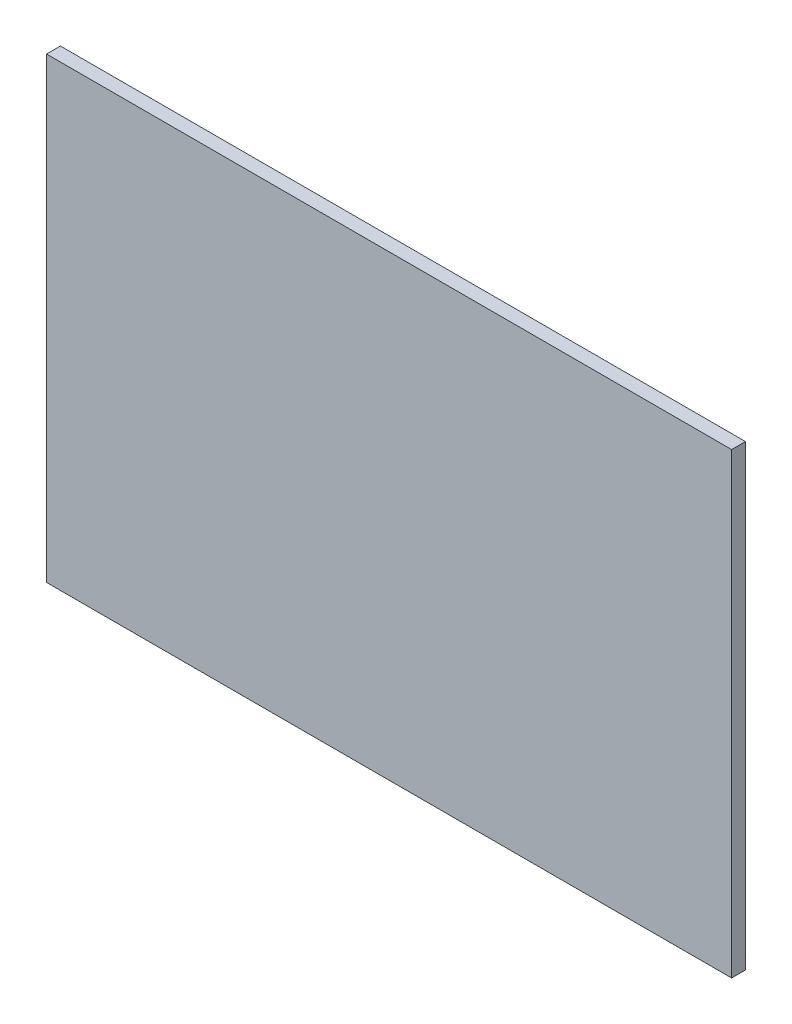
ISO-10303-21;
HEADER;
FILE_DESCRIPTION(('STEP AP214'),'2;1');
FILE_NAME('part.step','',(''),(''),'','','');
FILE_SCHEMA(('AUTOMOTIVE_DESIGN { 1 0 10303 214 1 1 1 1 }'));
ENDSEC;
DATA;
#1=APPLICATION_CONTEXT('core data for automotive mechanical design processes');
#2=APPLICATION_PROTOCOL_DEFINITION('international standard','automotive_design',2000,#1);
#3=PRODUCT_CONTEXT('',#1,'mechanical');
#4=PRODUCT('Part','Part','',(#3));
#5=PRODUCT_RELATED_PRODUCT_CATEGORY('part','',(#4));
#6=PRODUCT_DEFINITION_FORMATION('','',#4);
#7=PRODUCT_DEFINITION_CONTEXT('part definition',#1,'design');
#8=PRODUCT_DEFINITION('design','',#6,#7);
#9=PRODUCT_DEFINITION_SHAPE('','',#8);
#10=(LENGTH_UNIT() NAMED_UNIT(*) SI_UNIT(.MILLI.,.METRE.));
#11=(NAMED_UNIT(*) PLANE_ANGLE_UNIT() SI_UNIT($,.RADIAN.));
#12=(NAMED_UNIT(*) SI_UNIT($,.STERADIAN.) SOLID_ANGLE_UNIT());
#13=UNCERTAINTY_MEASURE_WITH_UNIT(LENGTH_MEASURE(1.E-05),#10,'distance_accuracy_value','');
#14=(GEOMETRIC_REPRESENTATION_CONTEXT(3) GLOBAL_UNCERTAINTY_ASSIGNED_CONTEXT((#13)) GLOBAL_UNIT_ASSIGNED_CONTEXT((#10,
#11,#12)) REPRESENTATION_CONTEXT('',''));
#15=CARTESIAN_POINT('',(0.,0.,0.));
#16=DIRECTION('',(0.,0.,1.));
#17=DIRECTION('',(1.,0.,0.));
#18=AXIS2_PLACEMENT_3D('',#15,#16,#17);
#19=CARTESIAN_POINT('',(0.,0.05,0.5));
#20=DIRECTION('',(0.,0.,1.));
#21=DIRECTION('',(1.,0.,0.));
#22=AXIS2_PLACEMENT_3D('',#19,#20,#21);
#23=PLANE('',#22);
#24=DIRECTION('',(0.,1.,0.));
#25=VECTOR('',#24,1.);
#26=CARTESIAN_POINT('',(-12.35,-8.2,0.5));
#27=LINE('',#26,#25);
#28=CARTESIAN_POINT('',(-12.35,-8.2,0.5));
#29=VERTEX_POINT('',#28);
#30=CARTESIAN_POINT('',(-12.35,8.3,0.5));
#31=VERTEX_POINT('',#30);
#32=EDGE_CURVE('E27',#29,#31,#27,.T.);
#33=ORIENTED_EDGE('',*,*,#32,.F.);
#34=DIRECTION('',(-1.,0.,0.));
#35=VECTOR('',#34,1.);
#36=CARTESIAN_POINT('',(12.35,-8.2,0.5));
#37=LINE('',#36,#35);
#38=CARTESIAN_POINT('',(12.35,-8.2,0.5));
#39=VERTEX_POINT('',#38);
#40=EDGE_CURVE('E60',#39,#29,#37,.T.);
#41=ORIENTED_EDGE('',*,*,#40,.F.);
#42=DIRECTION('',(0.,-1.,0.));
#43=VECTOR('',#42,1.);
#44=CARTESIAN_POINT('',(12.35,8.3,0.5));
#45=LINE('',#44,#43);
#46=CARTESIAN_POINT('',(12.35,8.3,0.5));
#47=VERTEX_POINT('',#46);
#48=EDGE_CURVE('E86',#47,#39,#45,.T.);
#49=ORIENTED_EDGE('',*,*,#48,.F.);
#50=DIRECTION('',(1.,0.,0.));
#51=VECTOR('',#50,1.);
#52=CARTESIAN_POINT('',(-12.35,8.3,0.5));
#53=LINE('',#52,#51);
#54=EDGE_CURVE('E91',#31,#47,#53,.T.);
#55=ORIENTED_EDGE('',*,*,#54,.F.);
#56=EDGE_LOOP('',(#33,#41,#49,#55));
#57=FACE_BOUND('',#56,.T.);
#58=ADVANCED_FACE('F17',(#57),#23,.T.);
#59=CARTESIAN_POINT('',(0.,0.05,0.));
#60=DIRECTION('',(0.,0.,1.));
#61=DIRECTION('',(1.,0.,0.));
#62=AXIS2_PLACEMENT_3D('',#59,#60,#61);
#63=PLANE('',#62);
#64=DIRECTION('',(1.,0.,0.));
#65=VECTOR('',#64,1.);
#66=CARTESIAN_POINT('',(-12.35,8.3,0.));
#67=LINE('',#66,#65);
#68=CARTESIAN_POINT('',(-12.35,8.3,0.));
#69=VERTEX_POINT('',#68);
#70=CARTESIAN_POINT('',(12.35,8.3,0.));
#71=VERTEX_POINT('',#70);
#72=EDGE_CURVE('E76',#69,#71,#67,.T.);
#73=ORIENTED_EDGE('',*,*,#72,.T.);
#74=DIRECTION('',(0.,-1.,0.));
#75=VECTOR('',#74,1.);
#76=CARTESIAN_POINT('',(12.35,8.3,0.));
#77=LINE('',#76,#75);
#78=CARTESIAN_POINT('',(12.35,-8.2,0.));
#79=VERTEX_POINT('',#78);
#80=EDGE_CURVE('E111',#71,#79,#77,.T.);
#81=ORIENTED_EDGE('',*,*,#80,.T.);
#82=DIRECTION('',(-1.,0.,0.));
#83=VECTOR('',#82,1.);
#84=CARTESIAN_POINT('',(12.35,-8.2,0.));
#85=LINE('',#84,#83);
#86=CARTESIAN_POINT('',(-12.35,-8.2,0.));
#87=VERTEX_POINT('',#86);
#88=EDGE_CURVE('E51',#79,#87,#85,.T.);
#89=ORIENTED_EDGE('',*,*,#88,.T.);
#90=DIRECTION('',(0.,1.,0.));
#91=VECTOR('',#90,1.);
#92=CARTESIAN_POINT('',(-12.35,-8.2,0.));
#93=LINE('',#92,#91);
#94=EDGE_CURVE('E11',#87,#69,#93,.T.);
#95=ORIENTED_EDGE('',*,*,#94,.T.);
#96=EDGE_LOOP('',(#73,#81,#89,#95));
#97=FACE_BOUND('',#96,.T.);
#98=ADVANCED_FACE('F19',(#97),#63,.F.);
#99=CARTESIAN_POINT('',(-12.35,-8.2,0.));
#100=DIRECTION('',(-1.,0.,0.));
#101=DIRECTION('',(0.,0.,1.));
#102=AXIS2_PLACEMENT_3D('',#99,#100,#101);
#103=PLANE('',#102);
#104=DIRECTION('',(0.,0.,1.));
#105=VECTOR('',#104,1.);
#106=CARTESIAN_POINT('',(-12.35,-8.2,0.));
#107=LINE('',#106,#105);
#108=EDGE_CURVE('E104',#87,#29,#107,.T.);
#109=ORIENTED_EDGE('',*,*,#108,.T.);
#110=ORIENTED_EDGE('',*,*,#32,.T.);
#111=DIRECTION('',(0.,0.,1.));
#112=VECTOR('',#111,1.);
#113=CARTESIAN_POINT('',(-12.35,8.3,0.));
#114=LINE('',#113,#112);
#115=EDGE_CURVE('E82',#69,#31,#114,.T.);
#116=ORIENTED_EDGE('',*,*,#115,.F.);
#117=ORIENTED_EDGE('',*,*,#94,.F.);
#118=EDGE_LOOP('',(#109,#110,#116,#117));
#119=FACE_BOUND('',#118,.T.);
#120=ADVANCED_FACE('F88',(#119),#103,.T.);
#121=CARTESIAN_POINT('',(12.35,-8.2,0.));
#122=DIRECTION('',(0.,-1.,0.));
#123=DIRECTION('',(0.,0.,-1.));
#124=AXIS2_PLACEMENT_3D('',#121,#122,#123);
#125=PLANE('',#124);
#126=DIRECTION('',(0.,0.,1.));
#127=VECTOR('',#126,1.);
#128=CARTESIAN_POINT('',(12.35,-8.2,0.));
#129=LINE('',#128,#127);
#130=EDGE_CURVE('E108',#79,#39,#129,.T.);
#131=ORIENTED_EDGE('',*,*,#130,.T.);
#132=ORIENTED_EDGE('',*,*,#40,.T.);
#133=ORIENTED_EDGE('',*,*,#108,.F.);
#134=ORIENTED_EDGE('',*,*,#88,.F.);
#135=EDGE_LOOP('',(#131,#132,#133,#134));
#136=FACE_BOUND('',#135,.T.);
#137=ADVANCED_FACE('F154',(#136),#125,.T.);
#138=CARTESIAN_POINT('',(12.35,8.3,0.));
#139=DIRECTION('',(1.,0.,0.));
#140=DIRECTION('',(0.,1.,0.));
#141=AXIS2_PLACEMENT_3D('',#138,#139,#140);
#142=PLANE('',#141);
#143=DIRECTION('',(0.,0.,1.));
#144=VECTOR('',#143,1.);
#145=CARTESIAN_POINT('',(12.35,8.3,0.));
#146=LINE('',#145,#144);
#147=EDGE_CURVE('E84',#71,#47,#146,.T.);
#148=ORIENTED_EDGE('',*,*,#147,.T.);
#149=ORIENTED_EDGE('',*,*,#48,.T.);
#150=ORIENTED_EDGE('',*,*,#130,.F.);
#151=ORIENTED_EDGE('',*,*,#80,.F.);
#152=EDGE_LOOP('',(#148,#149,#150,#151));
#153=FACE_BOUND('',#152,.T.);
#154=ADVANCED_FACE('F157',(#153),#142,.T.);
#155=CARTESIAN_POINT('',(-12.35,8.3,0.));
#156=DIRECTION('',(0.,1.,0.));
#157=DIRECTION('',(1.,0.,0.));
#158=AXIS2_PLACEMENT_3D('',#155,#156,#157);
#159=PLANE('',#158);
#160=ORIENTED_EDGE('',*,*,#115,.T.);
#161=ORIENTED_EDGE('',*,*,#54,.T.);
#162=ORIENTED_EDGE('',*,*,#147,.F.);
#163=ORIENTED_EDGE('',*,*,#72,.F.);
#164=EDGE_LOOP('',(#160,#161,#162,#163));
#165=FACE_BOUND('',#164,.T.);
#166=ADVANCED_FACE('F80',(#165),#159,.T.);
#167=CLOSED_SHELL('',(#58,#98,#120,#137,#154,#166));
#168=MANIFOLD_SOLID_BREP('B1',#167);
#169=ADVANCED_BREP_SHAPE_REPRESENTATION('',(#18,#168),#14);
#170=SHAPE_DEFINITION_REPRESENTATION(#9,#169);
ENDSEC;
END-ISO-10303-21;
